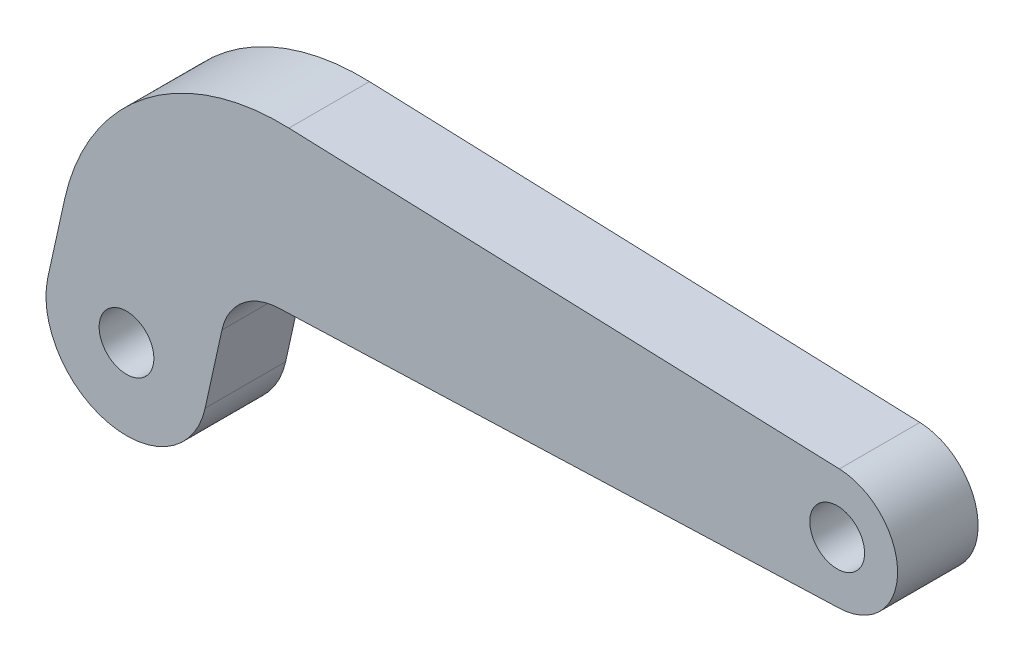
ISO-10303-21;
HEADER;
FILE_DESCRIPTION(('STEP AP214'),'2;1');
FILE_NAME('part.step','',(''),(''),'','','');
FILE_SCHEMA(('AUTOMOTIVE_DESIGN { 1 0 10303 214 1 1 1 1 }'));
ENDSEC;
DATA;
#1=APPLICATION_CONTEXT('core data for automotive mechanical design processes');
#2=APPLICATION_PROTOCOL_DEFINITION('international standard','automotive_design',2000,#1);
#3=PRODUCT_CONTEXT('',#1,'mechanical');
#4=PRODUCT('Part','Part','',(#3));
#5=PRODUCT_RELATED_PRODUCT_CATEGORY('part','',(#4));
#6=PRODUCT_DEFINITION_FORMATION('','',#4);
#7=PRODUCT_DEFINITION_CONTEXT('part definition',#1,'design');
#8=PRODUCT_DEFINITION('design','',#6,#7);
#9=PRODUCT_DEFINITION_SHAPE('','',#8);
#10=(LENGTH_UNIT() NAMED_UNIT(*) SI_UNIT(.MILLI.,.METRE.));
#11=(NAMED_UNIT(*) PLANE_ANGLE_UNIT() SI_UNIT($,.RADIAN.));
#12=(NAMED_UNIT(*) SI_UNIT($,.STERADIAN.) SOLID_ANGLE_UNIT());
#13=UNCERTAINTY_MEASURE_WITH_UNIT(LENGTH_MEASURE(1.E-05),#10,'distance_accuracy_value','');
#14=(GEOMETRIC_REPRESENTATION_CONTEXT(3) GLOBAL_UNCERTAINTY_ASSIGNED_CONTEXT((#13)) GLOBAL_UNIT_ASSIGNED_CONTEXT((#10,
#11,#12)) REPRESENTATION_CONTEXT('',''));
#15=CARTESIAN_POINT('',(0.,0.,0.));
#16=DIRECTION('',(0.,0.,1.));
#17=DIRECTION('',(1.,0.,0.));
#18=AXIS2_PLACEMENT_3D('',#15,#16,#17);
#19=CARTESIAN_POINT('',(56.0400460081838,14.7306282100645,3.175));
#20=DIRECTION('',(0.,0.,1.));
#21=DIRECTION('',(1.,0.,0.));
#22=AXIS2_PLACEMENT_3D('',#19,#20,#21);
#23=PLANE('',#22);
#24=CARTESIAN_POINT('',(0.,0.,3.175));
#25=DIRECTION('',(0.,0.,1.));
#26=DIRECTION('',(1.,0.,0.));
#27=AXIS2_PLACEMENT_3D('',#24,#25,#26);
#28=CIRCLE('',#27,2.159);
#29=CARTESIAN_POINT('',(2.159,0.,3.175));
#30=VERTEX_POINT('',#29);
#31=EDGE_CURVE('E142',#30,#30,#28,.T.);
#32=ORIENTED_EDGE('',*,*,#31,.F.);
#33=EDGE_LOOP('',(#32));
#34=FACE_BOUND('',#33,.T.);
#35=CARTESIAN_POINT('',(56.0400460081838,14.7306282100645,3.175));
#36=DIRECTION('',(0.,0.,1.));
#37=DIRECTION('',(1.,0.,0.));
#38=AXIS2_PLACEMENT_3D('',#35,#36,#37);
#39=CIRCLE('',#38,4.76249999999999);
#40=CARTESIAN_POINT('',(56.2124069057096,9.9712482114718,3.175));
#41=VERTEX_POINT('',#40);
#42=CARTESIAN_POINT('',(56.2124069057096,19.4900082086572,3.175));
#43=VERTEX_POINT('',#42);
#44=EDGE_CURVE('E153',#41,#43,#39,.T.);
#45=ORIENTED_EDGE('',*,*,#44,.T.);
#46=DIRECTION('',(-0.999344881594264,0.0361912645723642,0.));
#47=VECTOR('',#46,1.);
#48=CARTESIAN_POINT('',(56.2124069057096,19.4900082086572,3.175));
#49=LINE('',#48,#47);
#50=CARTESIAN_POINT('',(12.8078599344106,21.0619034292299,3.175));
#51=VERTEX_POINT('',#50);
#52=EDGE_CURVE('E101',#43,#51,#49,.T.);
#53=ORIENTED_EDGE('',*,*,#52,.T.);
#54=CARTESIAN_POINT('',(12.1758699768157,3.6108434343901,3.175));
#55=DIRECTION('',(0.,0.,1.));
#56=DIRECTION('',(1.,0.,0.));
#57=AXIS2_PLACEMENT_3D('',#54,#55,#56);
#58=CIRCLE('',#57,17.4625);
#59=CARTESIAN_POINT('',(-4.8768501727705,7.37164677276037,3.175));
#60=VERTEX_POINT('',#59);
#61=EDGE_CURVE('E168',#51,#60,#58,.T.);
#62=ORIENTED_EDGE('',*,*,#61,.T.);
#63=DIRECTION('',(-0.215364543356923,-0.976533723669933,0.));
#64=VECTOR('',#63,1.);
#65=CARTESIAN_POINT('',(-6.20098914530407,1.36756485031646,3.175));
#66=LINE('',#65,#64);
#67=CARTESIAN_POINT('',(-6.20098914530407,1.36756485031647,3.175));
#68=VERTEX_POINT('',#67);
#69=EDGE_CURVE('E181',#60,#68,#66,.T.);
#70=ORIENTED_EDGE('',*,*,#69,.T.);
#71=CARTESIAN_POINT('',(0.,0.,3.175));
#72=DIRECTION('',(0.,0.,1.));
#73=DIRECTION('',(1.,0.,0.));
#74=AXIS2_PLACEMENT_3D('',#71,#72,#73);
#75=CIRCLE('',#74,6.35);
#76=CARTESIAN_POINT('',(6.20098914530407,-1.36756485031646,3.175));
#77=VERTEX_POINT('',#76);
#78=EDGE_CURVE('E120',#68,#77,#75,.T.);
#79=ORIENTED_EDGE('',*,*,#78,.T.);
#80=DIRECTION('',(0.215364543356924,0.976533723669932,0.));
#81=VECTOR('',#80,1.);
#82=CARTESIAN_POINT('',(6.20098914530407,-1.36756485031646,3.175));
#83=LINE('',#82,#81);
#84=CARTESIAN_POINT('',(7.52512811783764,4.63651707212744,3.175));
#85=VERTEX_POINT('',#84);
#86=EDGE_CURVE('E114',#77,#85,#83,.T.);
#87=ORIENTED_EDGE('',*,*,#86,.T.);
#88=CARTESIAN_POINT('',(12.1758699768157,3.6108434343901,3.175));
#89=DIRECTION('',(0.,0.,-1.));
#90=DIRECTION('',(1.,0.,0.));
#91=AXIS2_PLACEMENT_3D('',#88,#89,#90);
#92=CIRCLE('',#91,4.7625);
#93=CARTESIAN_POINT('',(12.0035090792898,8.37022343298278,3.175));
#94=VERTEX_POINT('',#93);
#95=EDGE_CURVE('E118',#85,#94,#92,.T.);
#96=ORIENTED_EDGE('',*,*,#95,.T.);
#97=DIRECTION('',(0.999344881594264,0.0361912645723645,0.));
#98=VECTOR('',#97,1.);
#99=CARTESIAN_POINT('',(56.2124069057096,9.9712482114718,3.175));
#100=LINE('',#99,#98);
#101=EDGE_CURVE('E58',#94,#41,#100,.T.);
#102=ORIENTED_EDGE('',*,*,#101,.T.);
#103=EDGE_LOOP('',(#45,#53,#62,#70,#79,#87,#96,#102));
#104=FACE_BOUND('',#103,.T.);
#105=CARTESIAN_POINT('',(56.0400460081838,14.7306282100645,3.175));
#106=DIRECTION('',(0.,0.,1.));
#107=DIRECTION('',(1.,0.,0.));
#108=AXIS2_PLACEMENT_3D('',#105,#106,#107);
#109=CIRCLE('',#108,2.15899999999999);
#110=CARTESIAN_POINT('',(58.1990460081837,14.7306282100645,3.175));
#111=VERTEX_POINT('',#110);
#112=EDGE_CURVE('E190',#111,#111,#109,.T.);
#113=ORIENTED_EDGE('',*,*,#112,.F.);
#114=EDGE_LOOP('',(#113));
#115=FACE_BOUND('',#114,.T.);
#116=ADVANCED_FACE('F41',(#34,#104,#115),#23,.T.);
#117=CARTESIAN_POINT('',(56.0400460081838,14.7306282100645,-3.175));
#118=DIRECTION('',(0.,0.,1.));
#119=DIRECTION('',(1.,0.,0.));
#120=AXIS2_PLACEMENT_3D('',#117,#118,#119);
#121=PLANE('',#120);
#122=CARTESIAN_POINT('',(56.0400460081838,14.7306282100645,-3.175));
#123=DIRECTION('',(0.,0.,1.));
#124=DIRECTION('',(1.,0.,0.));
#125=AXIS2_PLACEMENT_3D('',#122,#123,#124);
#126=CIRCLE('',#125,4.76249999999999);
#127=CARTESIAN_POINT('',(56.2124069057096,9.9712482114718,-3.175));
#128=VERTEX_POINT('',#127);
#129=CARTESIAN_POINT('',(56.2124069057096,19.4900082086572,-3.175));
#130=VERTEX_POINT('',#129);
#131=EDGE_CURVE('E138',#128,#130,#126,.T.);
#132=ORIENTED_EDGE('',*,*,#131,.F.);
#133=DIRECTION('',(0.999344881594264,0.0361912645723645,0.));
#134=VECTOR('',#133,1.);
#135=CARTESIAN_POINT('',(56.2124069057096,9.9712482114718,-3.175));
#136=LINE('',#135,#134);
#137=CARTESIAN_POINT('',(12.0035090792898,8.37022343298278,-3.175));
#138=VERTEX_POINT('',#137);
#139=EDGE_CURVE('E93',#138,#128,#136,.T.);
#140=ORIENTED_EDGE('',*,*,#139,.F.);
#141=CARTESIAN_POINT('',(12.1758699768157,3.6108434343901,-3.175));
#142=DIRECTION('',(0.,0.,-1.));
#143=DIRECTION('',(1.,0.,0.));
#144=AXIS2_PLACEMENT_3D('',#141,#142,#143);
#145=CIRCLE('',#144,4.7625);
#146=CARTESIAN_POINT('',(7.52512811783764,4.63651707212744,-3.175));
#147=VERTEX_POINT('',#146);
#148=EDGE_CURVE('E87',#147,#138,#145,.T.);
#149=ORIENTED_EDGE('',*,*,#148,.F.);
#150=DIRECTION('',(0.215364543356924,0.976533723669932,0.));
#151=VECTOR('',#150,1.);
#152=CARTESIAN_POINT('',(6.20098914530407,-1.36756485031646,-3.175));
#153=LINE('',#152,#151);
#154=CARTESIAN_POINT('',(6.20098914530407,-1.36756485031646,-3.175));
#155=VERTEX_POINT('',#154);
#156=EDGE_CURVE('E128',#155,#147,#153,.T.);
#157=ORIENTED_EDGE('',*,*,#156,.F.);
#158=CARTESIAN_POINT('',(0.,0.,-3.175));
#159=DIRECTION('',(0.,0.,1.));
#160=DIRECTION('',(1.,0.,0.));
#161=AXIS2_PLACEMENT_3D('',#158,#159,#160);
#162=CIRCLE('',#161,6.35);
#163=CARTESIAN_POINT('',(-6.20098914530407,1.36756485031647,-3.175));
#164=VERTEX_POINT('',#163);
#165=EDGE_CURVE('E148',#164,#155,#162,.T.);
#166=ORIENTED_EDGE('',*,*,#165,.F.);
#167=DIRECTION('',(-0.215364543356923,-0.976533723669933,0.));
#168=VECTOR('',#167,1.);
#169=CARTESIAN_POINT('',(-6.20098914530407,1.36756485031646,-3.175));
#170=LINE('',#169,#168);
#171=CARTESIAN_POINT('',(-4.8768501727705,7.37164677276037,-3.175));
#172=VERTEX_POINT('',#171);
#173=EDGE_CURVE('E146',#172,#164,#170,.T.);
#174=ORIENTED_EDGE('',*,*,#173,.F.);
#175=CARTESIAN_POINT('',(12.1758699768157,3.6108434343901,-3.175));
#176=DIRECTION('',(0.,0.,1.));
#177=DIRECTION('',(1.,0.,0.));
#178=AXIS2_PLACEMENT_3D('',#175,#176,#177);
#179=CIRCLE('',#178,17.4625);
#180=CARTESIAN_POINT('',(12.8078599344106,21.0619034292299,-3.175));
#181=VERTEX_POINT('',#180);
#182=EDGE_CURVE('E144',#181,#172,#179,.T.);
#183=ORIENTED_EDGE('',*,*,#182,.F.);
#184=DIRECTION('',(-0.999344881594264,0.0361912645723642,0.));
#185=VECTOR('',#184,1.);
#186=CARTESIAN_POINT('',(56.2124069057096,19.4900082086572,-3.175));
#187=LINE('',#186,#185);
#188=EDGE_CURVE('E141',#130,#181,#187,.T.);
#189=ORIENTED_EDGE('',*,*,#188,.F.);
#190=EDGE_LOOP('',(#132,#140,#149,#157,#166,#174,#183,#189));
#191=FACE_BOUND('',#190,.T.);
#192=CARTESIAN_POINT('',(0.,0.,-3.175));
#193=DIRECTION('',(0.,0.,1.));
#194=DIRECTION('',(1.,0.,0.));
#195=AXIS2_PLACEMENT_3D('',#192,#193,#194);
#196=CIRCLE('',#195,2.159);
#197=CARTESIAN_POINT('',(2.159,0.,-3.175));
#198=VERTEX_POINT('',#197);
#199=EDGE_CURVE('E187',#198,#198,#196,.T.);
#200=ORIENTED_EDGE('',*,*,#199,.T.);
#201=EDGE_LOOP('',(#200));
#202=FACE_BOUND('',#201,.T.);
#203=CARTESIAN_POINT('',(56.0400460081838,14.7306282100645,-3.175));
#204=DIRECTION('',(0.,0.,1.));
#205=DIRECTION('',(1.,0.,0.));
#206=AXIS2_PLACEMENT_3D('',#203,#204,#205);
#207=CIRCLE('',#206,2.15899999999999);
#208=CARTESIAN_POINT('',(58.1990460081837,14.7306282100645,-3.175));
#209=VERTEX_POINT('',#208);
#210=EDGE_CURVE('E193',#209,#209,#207,.T.);
#211=ORIENTED_EDGE('',*,*,#210,.T.);
#212=EDGE_LOOP('',(#211));
#213=FACE_BOUND('',#212,.T.);
#214=ADVANCED_FACE('F172',(#191,#202,#213),#121,.F.);
#215=CARTESIAN_POINT('',(56.0400460081838,14.7306282100645,3.175));
#216=DIRECTION('',(0.,0.,-1.));
#217=DIRECTION('',(-1.,0.,0.));
#218=AXIS2_PLACEMENT_3D('',#215,#216,#217);
#219=CYLINDRICAL_SURFACE('',#218,4.76249999999999);
#220=ORIENTED_EDGE('',*,*,#131,.T.);
#221=DIRECTION('',(0.,0.,-1.));
#222=VECTOR('',#221,1.);
#223=CARTESIAN_POINT('',(56.2124069057096,19.4900082086572,3.175));
#224=LINE('',#223,#222);
#225=EDGE_CURVE('E11',#43,#130,#224,.T.);
#226=ORIENTED_EDGE('',*,*,#225,.F.);
#227=ORIENTED_EDGE('',*,*,#44,.F.);
#228=DIRECTION('',(0.,0.,-1.));
#229=VECTOR('',#228,1.);
#230=CARTESIAN_POINT('',(56.2124069057096,9.9712482114718,3.175));
#231=LINE('',#230,#229);
#232=EDGE_CURVE('E134',#41,#128,#231,.T.);
#233=ORIENTED_EDGE('',*,*,#232,.T.);
#234=EDGE_LOOP('',(#220,#226,#227,#233));
#235=FACE_BOUND('',#234,.T.);
#236=ADVANCED_FACE('F43',(#235),#219,.T.);
#237=CARTESIAN_POINT('',(56.2124069057096,19.4900082086572,3.175));
#238=DIRECTION('',(-0.0361912645723642,-0.999344881594264,0.));
#239=DIRECTION('',(0.999344881594264,-0.0361912645723642,0.));
#240=AXIS2_PLACEMENT_3D('',#237,#238,#239);
#241=PLANE('',#240);
#242=ORIENTED_EDGE('',*,*,#188,.T.);
#243=DIRECTION('',(0.,0.,-1.));
#244=VECTOR('',#243,1.);
#245=CARTESIAN_POINT('',(12.8078599344106,21.0619034292299,3.175));
#246=LINE('',#245,#244);
#247=EDGE_CURVE('E50',#51,#181,#246,.T.);
#248=ORIENTED_EDGE('',*,*,#247,.F.);
#249=ORIENTED_EDGE('',*,*,#52,.F.);
#250=ORIENTED_EDGE('',*,*,#225,.T.);
#251=EDGE_LOOP('',(#242,#248,#249,#250));
#252=FACE_BOUND('',#251,.T.);
#253=ADVANCED_FACE('F225',(#252),#241,.F.);
#254=CARTESIAN_POINT('',(12.1758699768157,3.6108434343901,3.175));
#255=DIRECTION('',(0.,0.,-1.));
#256=DIRECTION('',(-1.,0.,0.));
#257=AXIS2_PLACEMENT_3D('',#254,#255,#256);
#258=CYLINDRICAL_SURFACE('',#257,17.4625);
#259=ORIENTED_EDGE('',*,*,#182,.T.);
#260=DIRECTION('',(0.,0.,-1.));
#261=VECTOR('',#260,1.);
#262=CARTESIAN_POINT('',(-4.8768501727705,7.37164677276037,3.175));
#263=LINE('',#262,#261);
#264=EDGE_CURVE('E160',#60,#172,#263,.T.);
#265=ORIENTED_EDGE('',*,*,#264,.F.);
#266=ORIENTED_EDGE('',*,*,#61,.F.);
#267=ORIENTED_EDGE('',*,*,#247,.T.);
#268=EDGE_LOOP('',(#259,#265,#266,#267));
#269=FACE_BOUND('',#268,.T.);
#270=ADVANCED_FACE('F166',(#269),#258,.T.);
#271=CARTESIAN_POINT('',(-6.20098914530407,1.36756485031646,3.175));
#272=DIRECTION('',(0.976533723669932,-0.215364543356923,0.));
#273=DIRECTION('',(0.215364543356923,0.976533723669933,0.));
#274=AXIS2_PLACEMENT_3D('',#271,#272,#273);
#275=PLANE('',#274);
#276=ORIENTED_EDGE('',*,*,#173,.T.);
#277=DIRECTION('',(0.,0.,-1.));
#278=VECTOR('',#277,1.);
#279=CARTESIAN_POINT('',(-6.20098914530407,1.36756485031647,3.175));
#280=LINE('',#279,#278);
#281=EDGE_CURVE('E157',#68,#164,#280,.T.);
#282=ORIENTED_EDGE('',*,*,#281,.F.);
#283=ORIENTED_EDGE('',*,*,#69,.F.);
#284=ORIENTED_EDGE('',*,*,#264,.T.);
#285=EDGE_LOOP('',(#276,#282,#283,#284));
#286=FACE_BOUND('',#285,.T.);
#287=ADVANCED_FACE('F177',(#286),#275,.F.);
#288=CARTESIAN_POINT('',(0.,0.,3.175));
#289=DIRECTION('',(0.,0.,-1.));
#290=DIRECTION('',(-1.,0.,0.));
#291=AXIS2_PLACEMENT_3D('',#288,#289,#290);
#292=CYLINDRICAL_SURFACE('',#291,6.35);
#293=ORIENTED_EDGE('',*,*,#165,.T.);
#294=DIRECTION('',(0.,0.,-1.));
#295=VECTOR('',#294,1.);
#296=CARTESIAN_POINT('',(6.20098914530407,-1.36756485031646,3.175));
#297=LINE('',#296,#295);
#298=EDGE_CURVE('E129',#77,#155,#297,.T.);
#299=ORIENTED_EDGE('',*,*,#298,.F.);
#300=ORIENTED_EDGE('',*,*,#78,.F.);
#301=ORIENTED_EDGE('',*,*,#281,.T.);
#302=EDGE_LOOP('',(#293,#299,#300,#301));
#303=FACE_BOUND('',#302,.T.);
#304=ADVANCED_FACE('F180',(#303),#292,.T.);
#305=CARTESIAN_POINT('',(6.20098914530407,-1.36756485031646,3.175));
#306=DIRECTION('',(-0.976533723669932,0.215364543356924,0.));
#307=DIRECTION('',(-0.215364543356924,-0.976533723669932,0.));
#308=AXIS2_PLACEMENT_3D('',#305,#306,#307);
#309=PLANE('',#308);
#310=ORIENTED_EDGE('',*,*,#156,.T.);
#311=DIRECTION('',(0.,0.,-1.));
#312=VECTOR('',#311,1.);
#313=CARTESIAN_POINT('',(7.52512811783764,4.63651707212744,3.175));
#314=LINE('',#313,#312);
#315=EDGE_CURVE('E125',#85,#147,#314,.T.);
#316=ORIENTED_EDGE('',*,*,#315,.F.);
#317=ORIENTED_EDGE('',*,*,#86,.F.);
#318=ORIENTED_EDGE('',*,*,#298,.T.);
#319=EDGE_LOOP('',(#310,#316,#317,#318));
#320=FACE_BOUND('',#319,.T.);
#321=ADVANCED_FACE('F126',(#320),#309,.F.);
#322=CARTESIAN_POINT('',(12.1758699768157,3.6108434343901,3.175));
#323=DIRECTION('',(0.,0.,-1.));
#324=DIRECTION('',(-1.,0.,0.));
#325=AXIS2_PLACEMENT_3D('',#322,#323,#324);
#326=CYLINDRICAL_SURFACE('',#325,4.7625);
#327=ORIENTED_EDGE('',*,*,#148,.T.);
#328=DIRECTION('',(0.,0.,-1.));
#329=VECTOR('',#328,1.);
#330=CARTESIAN_POINT('',(12.0035090792898,8.37022343298278,3.175));
#331=LINE('',#330,#329);
#332=EDGE_CURVE('E130',#94,#138,#331,.T.);
#333=ORIENTED_EDGE('',*,*,#332,.F.);
#334=ORIENTED_EDGE('',*,*,#95,.F.);
#335=ORIENTED_EDGE('',*,*,#315,.T.);
#336=EDGE_LOOP('',(#327,#333,#334,#335));
#337=FACE_BOUND('',#336,.T.);
#338=ADVANCED_FACE('F132',(#337),#326,.F.);
#339=CARTESIAN_POINT('',(56.2124069057096,9.9712482114718,3.175));
#340=DIRECTION('',(-0.0361912645723645,0.999344881594264,0.));
#341=DIRECTION('',(-0.999344881594264,-0.0361912645723645,0.));
#342=AXIS2_PLACEMENT_3D('',#339,#340,#341);
#343=PLANE('',#342);
#344=ORIENTED_EDGE('',*,*,#139,.T.);
#345=ORIENTED_EDGE('',*,*,#232,.F.);
#346=ORIENTED_EDGE('',*,*,#101,.F.);
#347=ORIENTED_EDGE('',*,*,#332,.T.);
#348=EDGE_LOOP('',(#344,#345,#346,#347));
#349=FACE_BOUND('',#348,.T.);
#350=ADVANCED_FACE('F213',(#349),#343,.F.);
#351=CARTESIAN_POINT('',(0.,0.,3.175));
#352=DIRECTION('',(0.,0.,-1.));
#353=DIRECTION('',(-1.,0.,0.));
#354=AXIS2_PLACEMENT_3D('',#351,#352,#353);
#355=CYLINDRICAL_SURFACE('',#354,2.159);
#356=ORIENTED_EDGE('',*,*,#31,.T.);
#357=EDGE_LOOP('',(#356));
#358=FACE_BOUND('',#357,.T.);
#359=ORIENTED_EDGE('',*,*,#199,.F.);
#360=EDGE_LOOP('',(#359));
#361=FACE_BOUND('',#360,.T.);
#362=ADVANCED_FACE('F210',(#358,#361),#355,.F.);
#363=CARTESIAN_POINT('',(56.0400460081838,14.7306282100645,3.175));
#364=DIRECTION('',(0.,0.,-1.));
#365=DIRECTION('',(-1.,0.,0.));
#366=AXIS2_PLACEMENT_3D('',#363,#364,#365);
#367=CYLINDRICAL_SURFACE('',#366,2.15899999999999);
#368=ORIENTED_EDGE('',*,*,#112,.T.);
#369=EDGE_LOOP('',(#368));
#370=FACE_BOUND('',#369,.T.);
#371=ORIENTED_EDGE('',*,*,#210,.F.);
#372=EDGE_LOOP('',(#371));
#373=FACE_BOUND('',#372,.T.);
#374=ADVANCED_FACE('F199',(#370,#373),#367,.F.);
#375=CLOSED_SHELL('',(#116,#214,#236,#253,#270,#287,#304,#321,#338,#350,#362,#374));
#376=MANIFOLD_SOLID_BREP('B2',#375);
#377=ADVANCED_BREP_SHAPE_REPRESENTATION('',(#18,#376),#14);
#378=SHAPE_DEFINITION_REPRESENTATION(#9,#377);
ENDSEC;
END-ISO-10303-21;
